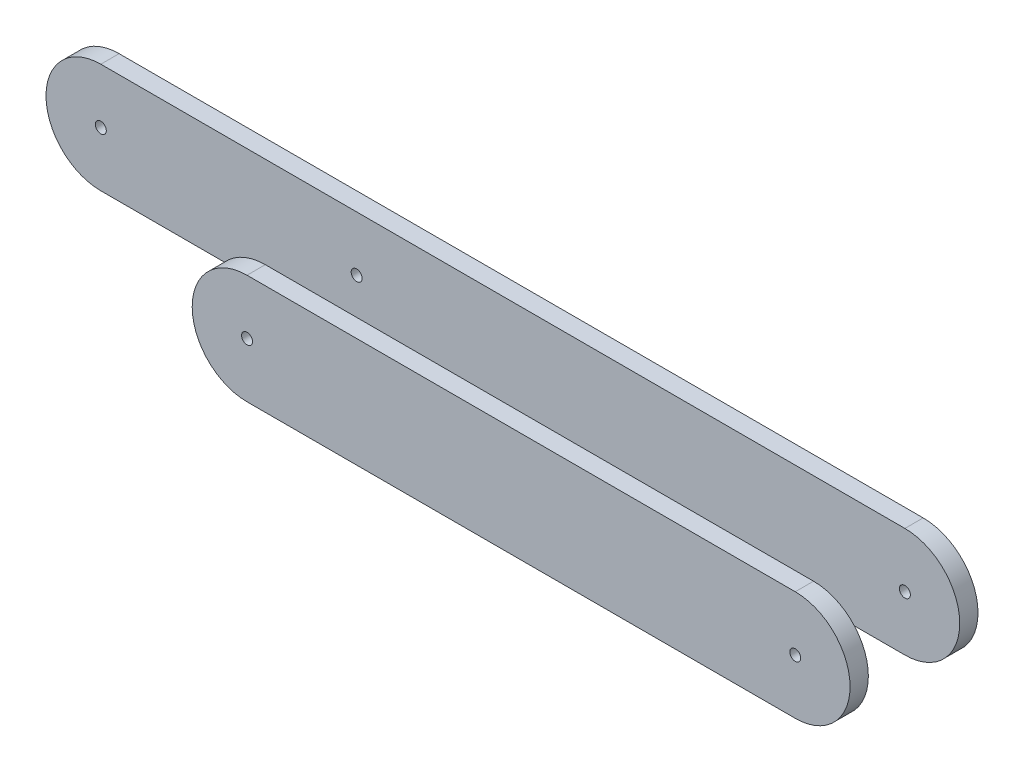
ISO-10303-21;
HEADER;
FILE_DESCRIPTION(('STEP AP214'),'2;1');
FILE_NAME('part.step','',(''),(''),'','','');
FILE_SCHEMA(('AUTOMOTIVE_DESIGN { 1 0 10303 214 1 1 1 1 }'));
ENDSEC;
DATA;
#1=APPLICATION_CONTEXT('core data for automotive mechanical design processes');
#2=APPLICATION_PROTOCOL_DEFINITION('international standard','automotive_design',2000,#1);
#3=PRODUCT_CONTEXT('',#1,'mechanical');
#4=PRODUCT('Part','Part','',(#3));
#5=PRODUCT_RELATED_PRODUCT_CATEGORY('part','',(#4));
#6=PRODUCT_DEFINITION_FORMATION('','',#4);
#7=PRODUCT_DEFINITION_CONTEXT('part definition',#1,'design');
#8=PRODUCT_DEFINITION('design','',#6,#7);
#9=PRODUCT_DEFINITION_SHAPE('','',#8);
#10=(LENGTH_UNIT() NAMED_UNIT(*) SI_UNIT(.MILLI.,.METRE.));
#11=(NAMED_UNIT(*) PLANE_ANGLE_UNIT() SI_UNIT($,.RADIAN.));
#12=(NAMED_UNIT(*) SI_UNIT($,.STERADIAN.) SOLID_ANGLE_UNIT());
#13=UNCERTAINTY_MEASURE_WITH_UNIT(LENGTH_MEASURE(1.E-05),#10,'distance_accuracy_value','');
#14=(GEOMETRIC_REPRESENTATION_CONTEXT(3) GLOBAL_UNCERTAINTY_ASSIGNED_CONTEXT((#13)) GLOBAL_UNIT_ASSIGNED_CONTEXT((#10,
#11,#12)) REPRESENTATION_CONTEXT('',''));
#15=CARTESIAN_POINT('',(0.,0.,0.));
#16=DIRECTION('',(0.,0.,1.));
#17=DIRECTION('',(1.,0.,0.));
#18=AXIS2_PLACEMENT_3D('',#15,#16,#17);
#19=CARTESIAN_POINT('',(-70.,0.,5.));
#20=DIRECTION('',(0.,0.,-1.));
#21=DIRECTION('',(-1.,0.,0.));
#22=AXIS2_PLACEMENT_3D('',#19,#20,#21);
#23=CYLINDRICAL_SURFACE('',#22,15.);
#24=CARTESIAN_POINT('',(-70.,0.,0.));
#25=DIRECTION('',(0.,0.,1.));
#26=DIRECTION('',(1.,0.,0.));
#27=AXIS2_PLACEMENT_3D('',#24,#25,#26);
#28=CIRCLE('',#27,15.);
#29=CARTESIAN_POINT('',(-70.,15.,0.));
#30=VERTEX_POINT('',#29);
#31=CARTESIAN_POINT('',(-70.,-15.,0.));
#32=VERTEX_POINT('',#31);
#33=EDGE_CURVE('P0_E79',#30,#32,#28,.T.);
#34=ORIENTED_EDGE('',*,*,#33,.T.);
#35=DIRECTION('',(0.,0.,-1.));
#36=VECTOR('',#35,1.);
#37=CARTESIAN_POINT('',(-70.,-15.,5.));
#38=LINE('',#37,#36);
#39=CARTESIAN_POINT('',(-70.,-15.,5.));
#40=VERTEX_POINT('',#39);
#41=EDGE_CURVE('P0_E11',#40,#32,#38,.T.);
#42=ORIENTED_EDGE('',*,*,#41,.F.);
#43=CARTESIAN_POINT('',(-70.,0.,5.));
#44=DIRECTION('',(0.,0.,1.));
#45=DIRECTION('',(1.,0.,0.));
#46=AXIS2_PLACEMENT_3D('',#43,#44,#45);
#47=CIRCLE('',#46,15.);
#48=CARTESIAN_POINT('',(-70.,15.,5.));
#49=VERTEX_POINT('',#48);
#50=EDGE_CURVE('P0_E67',#49,#40,#47,.T.);
#51=ORIENTED_EDGE('',*,*,#50,.F.);
#52=DIRECTION('',(0.,0.,-1.));
#53=VECTOR('',#52,1.);
#54=CARTESIAN_POINT('',(-70.,15.,5.));
#55=LINE('',#54,#53);
#56=EDGE_CURVE('P0_E75',#49,#30,#55,.T.);
#57=ORIENTED_EDGE('',*,*,#56,.T.);
#58=EDGE_LOOP('',(#34,#42,#51,#57));
#59=FACE_BOUND('',#58,.T.);
#60=ADVANCED_FACE('P0_F16',(#59),#23,.T.);
#61=CARTESIAN_POINT('',(-70.,-15.,5.));
#62=DIRECTION('',(0.,1.,0.));
#63=DIRECTION('',(-1.,0.,0.));
#64=AXIS2_PLACEMENT_3D('',#61,#62,#63);
#65=PLANE('',#64);
#66=DIRECTION('',(1.,0.,0.));
#67=VECTOR('',#66,1.);
#68=CARTESIAN_POINT('',(-70.,-15.,0.));
#69=LINE('',#68,#67);
#70=CARTESIAN_POINT('',(150.,-15.,0.));
#71=VERTEX_POINT('',#70);
#72=EDGE_CURVE('P0_E71',#32,#71,#69,.T.);
#73=ORIENTED_EDGE('',*,*,#72,.T.);
#74=DIRECTION('',(0.,0.,-1.));
#75=VECTOR('',#74,1.);
#76=CARTESIAN_POINT('',(150.,-15.,5.));
#77=LINE('',#76,#75);
#78=CARTESIAN_POINT('',(150.,-15.,5.));
#79=VERTEX_POINT('',#78);
#80=EDGE_CURVE('P0_E24',#79,#71,#77,.T.);
#81=ORIENTED_EDGE('',*,*,#80,.F.);
#82=DIRECTION('',(1.,0.,0.));
#83=VECTOR('',#82,1.);
#84=CARTESIAN_POINT('',(-70.,-15.,5.));
#85=LINE('',#84,#83);
#86=EDGE_CURVE('P0_E62',#40,#79,#85,.T.);
#87=ORIENTED_EDGE('',*,*,#86,.F.);
#88=ORIENTED_EDGE('',*,*,#41,.T.);
#89=EDGE_LOOP('',(#73,#81,#87,#88));
#90=FACE_BOUND('',#89,.T.);
#91=ADVANCED_FACE('P0_F70',(#90),#65,.F.);
#92=CARTESIAN_POINT('',(150.,0.,5.));
#93=DIRECTION('',(0.,0.,-1.));
#94=DIRECTION('',(-1.,0.,0.));
#95=AXIS2_PLACEMENT_3D('',#92,#93,#94);
#96=CYLINDRICAL_SURFACE('',#95,15.);
#97=CARTESIAN_POINT('',(150.,0.,0.));
#98=DIRECTION('',(0.,0.,1.));
#99=DIRECTION('',(1.,0.,0.));
#100=AXIS2_PLACEMENT_3D('',#97,#98,#99);
#101=CIRCLE('',#100,15.);
#102=CARTESIAN_POINT('',(150.,15.,0.));
#103=VERTEX_POINT('',#102);
#104=EDGE_CURVE('P0_E49',#71,#103,#101,.T.);
#105=ORIENTED_EDGE('',*,*,#104,.T.);
#106=DIRECTION('',(0.,0.,-1.));
#107=VECTOR('',#106,1.);
#108=CARTESIAN_POINT('',(150.,15.,5.));
#109=LINE('',#108,#107);
#110=CARTESIAN_POINT('',(150.,15.,5.));
#111=VERTEX_POINT('',#110);
#112=EDGE_CURVE('P0_E72',#111,#103,#109,.T.);
#113=ORIENTED_EDGE('',*,*,#112,.F.);
#114=CARTESIAN_POINT('',(150.,0.,5.));
#115=DIRECTION('',(0.,0.,1.));
#116=DIRECTION('',(1.,0.,0.));
#117=AXIS2_PLACEMENT_3D('',#114,#115,#116);
#118=CIRCLE('',#117,15.);
#119=EDGE_CURVE('P0_E65',#79,#111,#118,.T.);
#120=ORIENTED_EDGE('',*,*,#119,.F.);
#121=ORIENTED_EDGE('',*,*,#80,.T.);
#122=EDGE_LOOP('',(#105,#113,#120,#121));
#123=FACE_BOUND('',#122,.T.);
#124=ADVANCED_FACE('P0_F73',(#123),#96,.T.);
#125=CARTESIAN_POINT('',(-70.,15.,5.));
#126=DIRECTION('',(0.,-1.,0.));
#127=DIRECTION('',(1.,0.,0.));
#128=AXIS2_PLACEMENT_3D('',#125,#126,#127);
#129=PLANE('',#128);
#130=DIRECTION('',(-1.,0.,0.));
#131=VECTOR('',#130,1.);
#132=CARTESIAN_POINT('',(-70.,15.,0.));
#133=LINE('',#132,#131);
#134=EDGE_CURVE('P0_E55',#103,#30,#133,.T.);
#135=ORIENTED_EDGE('',*,*,#134,.T.);
#136=ORIENTED_EDGE('',*,*,#56,.F.);
#137=DIRECTION('',(-1.,0.,0.));
#138=VECTOR('',#137,1.);
#139=CARTESIAN_POINT('',(-70.,15.,5.));
#140=LINE('',#139,#138);
#141=EDGE_CURVE('P0_E32',#111,#49,#140,.T.);
#142=ORIENTED_EDGE('',*,*,#141,.F.);
#143=ORIENTED_EDGE('',*,*,#112,.T.);
#144=EDGE_LOOP('',(#135,#136,#142,#143));
#145=FACE_BOUND('',#144,.T.);
#146=ADVANCED_FACE('P0_F87',(#145),#129,.F.);
#147=CARTESIAN_POINT('',(-70.,0.,5.));
#148=DIRECTION('',(0.,0.,1.));
#149=DIRECTION('',(1.,0.,0.));
#150=AXIS2_PLACEMENT_3D('',#147,#148,#149);
#151=PLANE('',#150);
#152=CARTESIAN_POINT('',(150.,0.,5.));
#153=DIRECTION('',(0.,0.,-1.));
#154=DIRECTION('',(-1.,0.,0.));
#155=AXIS2_PLACEMENT_3D('',#152,#153,#154);
#156=CIRCLE('',#155,1.5);
#157=CARTESIAN_POINT('',(148.5,0.,5.));
#158=VERTEX_POINT('',#157);
#159=EDGE_CURVE('P0_E82',#158,#158,#156,.T.);
#160=ORIENTED_EDGE('',*,*,#159,.T.);
#161=EDGE_LOOP('',(#160));
#162=FACE_BOUND('',#161,.T.);
#163=CARTESIAN_POINT('',(0.,0.,5.));
#164=DIRECTION('',(0.,0.,-1.));
#165=DIRECTION('',(-1.,0.,0.));
#166=AXIS2_PLACEMENT_3D('',#163,#164,#165);
#167=CIRCLE('',#166,1.5);
#168=CARTESIAN_POINT('',(-1.5,0.,5.));
#169=VERTEX_POINT('',#168);
#170=EDGE_CURVE('P0_E102',#169,#169,#167,.T.);
#171=ORIENTED_EDGE('',*,*,#170,.T.);
#172=EDGE_LOOP('',(#171));
#173=FACE_BOUND('',#172,.T.);
#174=CARTESIAN_POINT('',(-70.,0.,5.));
#175=DIRECTION('',(0.,0.,-1.));
#176=DIRECTION('',(-1.,0.,0.));
#177=AXIS2_PLACEMENT_3D('',#174,#175,#176);
#178=CIRCLE('',#177,1.5);
#179=CARTESIAN_POINT('',(-71.5,0.,5.));
#180=VERTEX_POINT('',#179);
#181=EDGE_CURVE('P0_E96',#180,#180,#178,.T.);
#182=ORIENTED_EDGE('',*,*,#181,.T.);
#183=EDGE_LOOP('',(#182));
#184=FACE_BOUND('',#183,.T.);
#185=ORIENTED_EDGE('',*,*,#50,.T.);
#186=ORIENTED_EDGE('',*,*,#86,.T.);
#187=ORIENTED_EDGE('',*,*,#119,.T.);
#188=ORIENTED_EDGE('',*,*,#141,.T.);
#189=EDGE_LOOP('',(#185,#186,#187,#188));
#190=FACE_BOUND('',#189,.T.);
#191=ADVANCED_FACE('P0_F63',(#162,#173,#184,#190),#151,.T.);
#192=CARTESIAN_POINT('',(-70.,0.,0.));
#193=DIRECTION('',(0.,0.,1.));
#194=DIRECTION('',(1.,0.,0.));
#195=AXIS2_PLACEMENT_3D('',#192,#193,#194);
#196=PLANE('',#195);
#197=CARTESIAN_POINT('',(150.,0.,0.));
#198=DIRECTION('',(0.,0.,-1.));
#199=DIRECTION('',(-1.,0.,0.));
#200=AXIS2_PLACEMENT_3D('',#197,#198,#199);
#201=CIRCLE('',#200,1.5);
#202=CARTESIAN_POINT('',(148.5,0.,0.));
#203=VERTEX_POINT('',#202);
#204=EDGE_CURVE('P0_E105',#203,#203,#201,.T.);
#205=ORIENTED_EDGE('',*,*,#204,.F.);
#206=EDGE_LOOP('',(#205));
#207=FACE_BOUND('',#206,.T.);
#208=CARTESIAN_POINT('',(0.,0.,0.));
#209=DIRECTION('',(0.,0.,-1.));
#210=DIRECTION('',(-1.,0.,0.));
#211=AXIS2_PLACEMENT_3D('',#208,#209,#210);
#212=CIRCLE('',#211,1.5);
#213=CARTESIAN_POINT('',(-1.5,0.,0.));
#214=VERTEX_POINT('',#213);
#215=EDGE_CURVE('P0_E99',#214,#214,#212,.T.);
#216=ORIENTED_EDGE('',*,*,#215,.F.);
#217=EDGE_LOOP('',(#216));
#218=FACE_BOUND('',#217,.T.);
#219=CARTESIAN_POINT('',(-70.,0.,0.));
#220=DIRECTION('',(0.,0.,-1.));
#221=DIRECTION('',(-1.,0.,0.));
#222=AXIS2_PLACEMENT_3D('',#219,#220,#221);
#223=CIRCLE('',#222,1.5);
#224=CARTESIAN_POINT('',(-71.5,0.,0.));
#225=VERTEX_POINT('',#224);
#226=EDGE_CURVE('P0_E93',#225,#225,#223,.T.);
#227=ORIENTED_EDGE('',*,*,#226,.F.);
#228=EDGE_LOOP('',(#227));
#229=FACE_BOUND('',#228,.T.);
#230=ORIENTED_EDGE('',*,*,#33,.F.);
#231=ORIENTED_EDGE('',*,*,#134,.F.);
#232=ORIENTED_EDGE('',*,*,#104,.F.);
#233=ORIENTED_EDGE('',*,*,#72,.F.);
#234=EDGE_LOOP('',(#230,#231,#232,#233));
#235=FACE_BOUND('',#234,.T.);
#236=ADVANCED_FACE('P0_F90',(#207,#218,#229,#235),#196,.F.);
#237=CARTESIAN_POINT('',(-70.,0.,5.));
#238=DIRECTION('',(0.,0.,-1.));
#239=DIRECTION('',(-1.,0.,0.));
#240=AXIS2_PLACEMENT_3D('',#237,#238,#239);
#241=CYLINDRICAL_SURFACE('',#240,1.5);
#242=ORIENTED_EDGE('',*,*,#181,.F.);
#243=EDGE_LOOP('',(#242));
#244=FACE_BOUND('',#243,.T.);
#245=ORIENTED_EDGE('',*,*,#226,.T.);
#246=EDGE_LOOP('',(#245));
#247=FACE_BOUND('',#246,.T.);
#248=ADVANCED_FACE('P0_F122',(#244,#247),#241,.F.);
#249=CARTESIAN_POINT('',(0.,0.,5.));
#250=DIRECTION('',(0.,0.,-1.));
#251=DIRECTION('',(-1.,0.,0.));
#252=AXIS2_PLACEMENT_3D('',#249,#250,#251);
#253=CYLINDRICAL_SURFACE('',#252,1.5);
#254=ORIENTED_EDGE('',*,*,#170,.F.);
#255=EDGE_LOOP('',(#254));
#256=FACE_BOUND('',#255,.T.);
#257=ORIENTED_EDGE('',*,*,#215,.T.);
#258=EDGE_LOOP('',(#257));
#259=FACE_BOUND('',#258,.T.);
#260=ADVANCED_FACE('P0_F116',(#256,#259),#253,.F.);
#261=CARTESIAN_POINT('',(150.,0.,5.));
#262=DIRECTION('',(0.,0.,-1.));
#263=DIRECTION('',(-1.,0.,0.));
#264=AXIS2_PLACEMENT_3D('',#261,#262,#263);
#265=CYLINDRICAL_SURFACE('',#264,1.5);
#266=ORIENTED_EDGE('',*,*,#159,.F.);
#267=EDGE_LOOP('',(#266));
#268=FACE_BOUND('',#267,.T.);
#269=ORIENTED_EDGE('',*,*,#204,.T.);
#270=EDGE_LOOP('',(#269));
#271=FACE_BOUND('',#270,.T.);
#272=ADVANCED_FACE('P0_F113',(#268,#271),#265,.F.);
#273=CLOSED_SHELL('',(#60,#91,#124,#146,#191,#236,#248,#260,#272));
#274=MANIFOLD_SOLID_BREP('P0_B1',#273);
#275=CARTESIAN_POINT('',(0.,0.,35.));
#276=DIRECTION('',(0.,0.,-1.));
#277=DIRECTION('',(-1.,0.,0.));
#278=AXIS2_PLACEMENT_3D('',#275,#276,#277);
#279=CYLINDRICAL_SURFACE('',#278,15.);
#280=CARTESIAN_POINT('',(0.,0.,30.));
#281=DIRECTION('',(0.,0.,1.));
#282=DIRECTION('',(1.,0.,0.));
#283=AXIS2_PLACEMENT_3D('',#280,#281,#282);
#284=CIRCLE('',#283,15.);
#285=CARTESIAN_POINT('',(0.,15.,30.));
#286=VERTEX_POINT('',#285);
#287=CARTESIAN_POINT('',(0.,-15.,30.));
#288=VERTEX_POINT('',#287);
#289=EDGE_CURVE('P1_E79',#286,#288,#284,.T.);
#290=ORIENTED_EDGE('',*,*,#289,.T.);
#291=DIRECTION('',(0.,0.,-1.));
#292=VECTOR('',#291,1.);
#293=CARTESIAN_POINT('',(0.,-15.,35.));
#294=LINE('',#293,#292);
#295=CARTESIAN_POINT('',(0.,-15.,35.));
#296=VERTEX_POINT('',#295);
#297=EDGE_CURVE('P1_E11',#296,#288,#294,.T.);
#298=ORIENTED_EDGE('',*,*,#297,.F.);
#299=CARTESIAN_POINT('',(0.,0.,35.));
#300=DIRECTION('',(0.,0.,1.));
#301=DIRECTION('',(1.,0.,0.));
#302=AXIS2_PLACEMENT_3D('',#299,#300,#301);
#303=CIRCLE('',#302,15.);
#304=CARTESIAN_POINT('',(0.,15.,35.));
#305=VERTEX_POINT('',#304);
#306=EDGE_CURVE('P1_E67',#305,#296,#303,.T.);
#307=ORIENTED_EDGE('',*,*,#306,.F.);
#308=DIRECTION('',(0.,0.,-1.));
#309=VECTOR('',#308,1.);
#310=CARTESIAN_POINT('',(0.,15.,35.));
#311=LINE('',#310,#309);
#312=EDGE_CURVE('P1_E75',#305,#286,#311,.T.);
#313=ORIENTED_EDGE('',*,*,#312,.T.);
#314=EDGE_LOOP('',(#290,#298,#307,#313));
#315=FACE_BOUND('',#314,.T.);
#316=ADVANCED_FACE('P1_F16',(#315),#279,.T.);
#317=CARTESIAN_POINT('',(0.,-15.,35.));
#318=DIRECTION('',(0.,1.,0.));
#319=DIRECTION('',(0.,0.,1.));
#320=AXIS2_PLACEMENT_3D('',#317,#318,#319);
#321=PLANE('',#320);
#322=DIRECTION('',(1.,0.,0.));
#323=VECTOR('',#322,1.);
#324=CARTESIAN_POINT('',(0.,-15.,30.));
#325=LINE('',#324,#323);
#326=CARTESIAN_POINT('',(150.,-15.,30.));
#327=VERTEX_POINT('',#326);
#328=EDGE_CURVE('P1_E71',#288,#327,#325,.T.);
#329=ORIENTED_EDGE('',*,*,#328,.T.);
#330=DIRECTION('',(0.,0.,-1.));
#331=VECTOR('',#330,1.);
#332=CARTESIAN_POINT('',(150.,-15.,35.));
#333=LINE('',#332,#331);
#334=CARTESIAN_POINT('',(150.,-15.,35.));
#335=VERTEX_POINT('',#334);
#336=EDGE_CURVE('P1_E24',#335,#327,#333,.T.);
#337=ORIENTED_EDGE('',*,*,#336,.F.);
#338=DIRECTION('',(1.,0.,0.));
#339=VECTOR('',#338,1.);
#340=CARTESIAN_POINT('',(0.,-15.,35.));
#341=LINE('',#340,#339);
#342=EDGE_CURVE('P1_E62',#296,#335,#341,.T.);
#343=ORIENTED_EDGE('',*,*,#342,.F.);
#344=ORIENTED_EDGE('',*,*,#297,.T.);
#345=EDGE_LOOP('',(#329,#337,#343,#344));
#346=FACE_BOUND('',#345,.T.);
#347=ADVANCED_FACE('P1_F70',(#346),#321,.F.);
#348=CARTESIAN_POINT('',(150.,0.,35.));
#349=DIRECTION('',(0.,0.,-1.));
#350=DIRECTION('',(-1.,0.,0.));
#351=AXIS2_PLACEMENT_3D('',#348,#349,#350);
#352=CYLINDRICAL_SURFACE('',#351,15.);
#353=CARTESIAN_POINT('',(150.,0.,30.));
#354=DIRECTION('',(0.,0.,1.));
#355=DIRECTION('',(1.,0.,0.));
#356=AXIS2_PLACEMENT_3D('',#353,#354,#355);
#357=CIRCLE('',#356,15.);
#358=CARTESIAN_POINT('',(150.,15.,30.));
#359=VERTEX_POINT('',#358);
#360=EDGE_CURVE('P1_E49',#327,#359,#357,.T.);
#361=ORIENTED_EDGE('',*,*,#360,.T.);
#362=DIRECTION('',(0.,0.,-1.));
#363=VECTOR('',#362,1.);
#364=CARTESIAN_POINT('',(150.,15.,35.));
#365=LINE('',#364,#363);
#366=CARTESIAN_POINT('',(150.,15.,35.));
#367=VERTEX_POINT('',#366);
#368=EDGE_CURVE('P1_E72',#367,#359,#365,.T.);
#369=ORIENTED_EDGE('',*,*,#368,.F.);
#370=CARTESIAN_POINT('',(150.,0.,35.));
#371=DIRECTION('',(0.,0.,1.));
#372=DIRECTION('',(1.,0.,0.));
#373=AXIS2_PLACEMENT_3D('',#370,#371,#372);
#374=CIRCLE('',#373,15.);
#375=EDGE_CURVE('P1_E65',#335,#367,#374,.T.);
#376=ORIENTED_EDGE('',*,*,#375,.F.);
#377=ORIENTED_EDGE('',*,*,#336,.T.);
#378=EDGE_LOOP('',(#361,#369,#376,#377));
#379=FACE_BOUND('',#378,.T.);
#380=ADVANCED_FACE('P1_F73',(#379),#352,.T.);
#381=CARTESIAN_POINT('',(0.,15.,35.));
#382=DIRECTION('',(0.,-1.,0.));
#383=DIRECTION('',(0.,0.,-1.));
#384=AXIS2_PLACEMENT_3D('',#381,#382,#383);
#385=PLANE('',#384);
#386=DIRECTION('',(-1.,0.,0.));
#387=VECTOR('',#386,1.);
#388=CARTESIAN_POINT('',(0.,15.,30.));
#389=LINE('',#388,#387);
#390=EDGE_CURVE('P1_E55',#359,#286,#389,.T.);
#391=ORIENTED_EDGE('',*,*,#390,.T.);
#392=ORIENTED_EDGE('',*,*,#312,.F.);
#393=DIRECTION('',(-1.,0.,0.));
#394=VECTOR('',#393,1.);
#395=CARTESIAN_POINT('',(0.,15.,35.));
#396=LINE('',#395,#394);
#397=EDGE_CURVE('P1_E32',#367,#305,#396,.T.);
#398=ORIENTED_EDGE('',*,*,#397,.F.);
#399=ORIENTED_EDGE('',*,*,#368,.T.);
#400=EDGE_LOOP('',(#391,#392,#398,#399));
#401=FACE_BOUND('',#400,.T.);
#402=ADVANCED_FACE('P1_F87',(#401),#385,.F.);
#403=CARTESIAN_POINT('',(0.,0.,35.));
#404=DIRECTION('',(0.,0.,1.));
#405=DIRECTION('',(1.,0.,0.));
#406=AXIS2_PLACEMENT_3D('',#403,#404,#405);
#407=PLANE('',#406);
#408=CARTESIAN_POINT('',(0.,0.,35.));
#409=DIRECTION('',(0.,0.,-1.));
#410=DIRECTION('',(-1.,0.,0.));
#411=AXIS2_PLACEMENT_3D('',#408,#409,#410);
#412=CIRCLE('',#411,1.5);
#413=CARTESIAN_POINT('',(-1.5,0.,35.));
#414=VERTEX_POINT('',#413);
#415=EDGE_CURVE('P1_E82',#414,#414,#412,.T.);
#416=ORIENTED_EDGE('',*,*,#415,.T.);
#417=EDGE_LOOP('',(#416));
#418=FACE_BOUND('',#417,.T.);
#419=CARTESIAN_POINT('',(150.,0.,35.));
#420=DIRECTION('',(0.,0.,-1.));
#421=DIRECTION('',(-1.,0.,0.));
#422=AXIS2_PLACEMENT_3D('',#419,#420,#421);
#423=CIRCLE('',#422,1.5);
#424=CARTESIAN_POINT('',(148.5,0.,35.));
#425=VERTEX_POINT('',#424);
#426=EDGE_CURVE('P1_E96',#425,#425,#423,.T.);
#427=ORIENTED_EDGE('',*,*,#426,.T.);
#428=EDGE_LOOP('',(#427));
#429=FACE_BOUND('',#428,.T.);
#430=ORIENTED_EDGE('',*,*,#306,.T.);
#431=ORIENTED_EDGE('',*,*,#342,.T.);
#432=ORIENTED_EDGE('',*,*,#375,.T.);
#433=ORIENTED_EDGE('',*,*,#397,.T.);
#434=EDGE_LOOP('',(#430,#431,#432,#433));
#435=FACE_BOUND('',#434,.T.);
#436=ADVANCED_FACE('P1_F63',(#418,#429,#435),#407,.T.);
#437=CARTESIAN_POINT('',(0.,0.,30.));
#438=DIRECTION('',(0.,0.,1.));
#439=DIRECTION('',(1.,0.,0.));
#440=AXIS2_PLACEMENT_3D('',#437,#438,#439);
#441=PLANE('',#440);
#442=CARTESIAN_POINT('',(0.,0.,30.));
#443=DIRECTION('',(0.,0.,-1.));
#444=DIRECTION('',(-1.,0.,0.));
#445=AXIS2_PLACEMENT_3D('',#442,#443,#444);
#446=CIRCLE('',#445,1.5);
#447=CARTESIAN_POINT('',(-1.5,0.,30.));
#448=VERTEX_POINT('',#447);
#449=EDGE_CURVE('P1_E99',#448,#448,#446,.T.);
#450=ORIENTED_EDGE('',*,*,#449,.F.);
#451=EDGE_LOOP('',(#450));
#452=FACE_BOUND('',#451,.T.);
#453=CARTESIAN_POINT('',(150.,0.,30.));
#454=DIRECTION('',(0.,0.,-1.));
#455=DIRECTION('',(-1.,0.,0.));
#456=AXIS2_PLACEMENT_3D('',#453,#454,#455);
#457=CIRCLE('',#456,1.5);
#458=CARTESIAN_POINT('',(148.5,0.,30.));
#459=VERTEX_POINT('',#458);
#460=EDGE_CURVE('P1_E93',#459,#459,#457,.T.);
#461=ORIENTED_EDGE('',*,*,#460,.F.);
#462=EDGE_LOOP('',(#461));
#463=FACE_BOUND('',#462,.T.);
#464=ORIENTED_EDGE('',*,*,#289,.F.);
#465=ORIENTED_EDGE('',*,*,#390,.F.);
#466=ORIENTED_EDGE('',*,*,#360,.F.);
#467=ORIENTED_EDGE('',*,*,#328,.F.);
#468=EDGE_LOOP('',(#464,#465,#466,#467));
#469=FACE_BOUND('',#468,.T.);
#470=ADVANCED_FACE('P1_F90',(#452,#463,#469),#441,.F.);
#471=CARTESIAN_POINT('',(150.,0.,35.));
#472=DIRECTION('',(0.,0.,-1.));
#473=DIRECTION('',(-1.,0.,0.));
#474=AXIS2_PLACEMENT_3D('',#471,#472,#473);
#475=CYLINDRICAL_SURFACE('',#474,1.5);
#476=ORIENTED_EDGE('',*,*,#426,.F.);
#477=EDGE_LOOP('',(#476));
#478=FACE_BOUND('',#477,.T.);
#479=ORIENTED_EDGE('',*,*,#460,.T.);
#480=EDGE_LOOP('',(#479));
#481=FACE_BOUND('',#480,.T.);
#482=ADVANCED_FACE('P1_F110',(#478,#481),#475,.F.);
#483=CARTESIAN_POINT('',(0.,0.,35.));
#484=DIRECTION('',(0.,0.,-1.));
#485=DIRECTION('',(-1.,0.,0.));
#486=AXIS2_PLACEMENT_3D('',#483,#484,#485);
#487=CYLINDRICAL_SURFACE('',#486,1.5);
#488=ORIENTED_EDGE('',*,*,#415,.F.);
#489=EDGE_LOOP('',(#488));
#490=FACE_BOUND('',#489,.T.);
#491=ORIENTED_EDGE('',*,*,#449,.T.);
#492=EDGE_LOOP('',(#491));
#493=FACE_BOUND('',#492,.T.);
#494=ADVANCED_FACE('P1_F107',(#490,#493),#487,.F.);
#495=CLOSED_SHELL('',(#316,#347,#380,#402,#436,#470,#482,#494));
#496=MANIFOLD_SOLID_BREP('P1_B1',#495);
#497=ADVANCED_BREP_SHAPE_REPRESENTATION('',(#18,#274,#496),#14);
#498=SHAPE_DEFINITION_REPRESENTATION(#9,#497);
ENDSEC;
END-ISO-10303-21;
